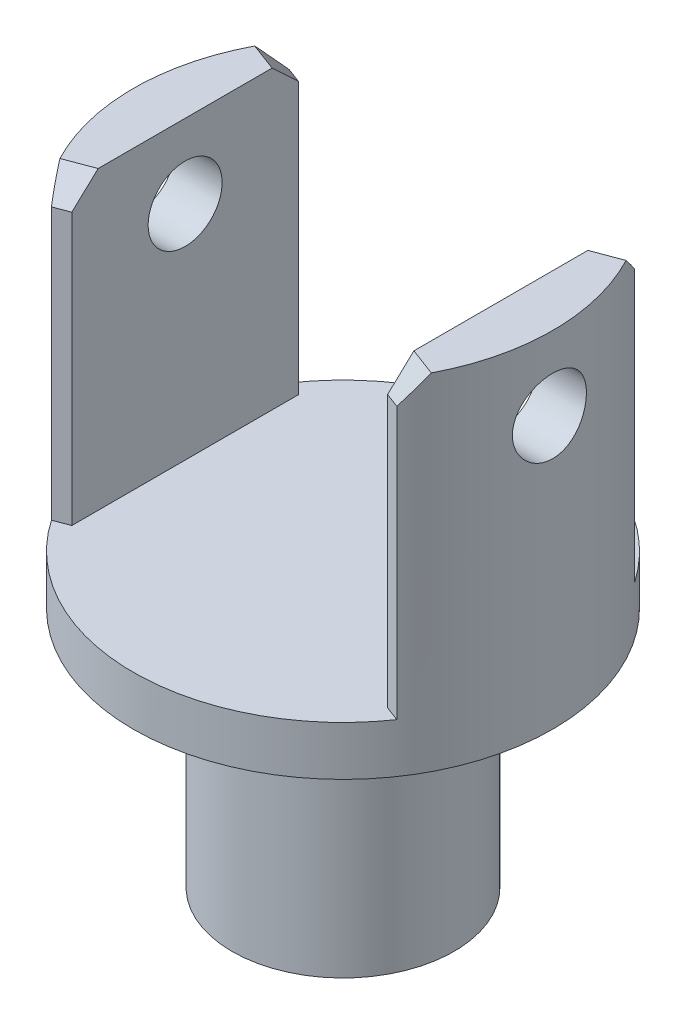
ISO-10303-21;
HEADER;
FILE_DESCRIPTION(('STEP AP214'),'2;1');
FILE_NAME('part.step','',(''),(''),'','','');
FILE_SCHEMA(('AUTOMOTIVE_DESIGN { 1 0 10303 214 1 1 1 1 }'));
ENDSEC;
DATA;
#1=APPLICATION_CONTEXT('core data for automotive mechanical design processes');
#2=APPLICATION_PROTOCOL_DEFINITION('international standard','automotive_design',2000,#1);
#3=PRODUCT_CONTEXT('',#1,'mechanical');
#4=PRODUCT('Part','Part','',(#3));
#5=PRODUCT_RELATED_PRODUCT_CATEGORY('part','',(#4));
#6=PRODUCT_DEFINITION_FORMATION('','',#4);
#7=PRODUCT_DEFINITION_CONTEXT('part definition',#1,'design');
#8=PRODUCT_DEFINITION('design','',#6,#7);
#9=PRODUCT_DEFINITION_SHAPE('','',#8);
#10=(LENGTH_UNIT() NAMED_UNIT(*) SI_UNIT(.MILLI.,.METRE.));
#11=(NAMED_UNIT(*) PLANE_ANGLE_UNIT() SI_UNIT($,.RADIAN.));
#12=(NAMED_UNIT(*) SI_UNIT($,.STERADIAN.) SOLID_ANGLE_UNIT());
#13=UNCERTAINTY_MEASURE_WITH_UNIT(LENGTH_MEASURE(1.E-05),#10,'distance_accuracy_value','');
#14=(GEOMETRIC_REPRESENTATION_CONTEXT(3) GLOBAL_UNCERTAINTY_ASSIGNED_CONTEXT((#13)) GLOBAL_UNIT_ASSIGNED_CONTEXT((#10,
#11,#12)) REPRESENTATION_CONTEXT('',''));
#15=CARTESIAN_POINT('',(0.,0.,0.));
#16=DIRECTION('',(0.,0.,1.));
#17=DIRECTION('',(1.,0.,0.));
#18=AXIS2_PLACEMENT_3D('',#15,#16,#17);
#19=CARTESIAN_POINT('',(0.,0.,0.));
#20=DIRECTION('',(0.,1.,0.));
#21=DIRECTION('',(0.,0.,1.));
#22=AXIS2_PLACEMENT_3D('',#19,#20,#21);
#23=PLANE('',#22);
#24=CARTESIAN_POINT('',(0.,0.,0.));
#25=DIRECTION('',(0.,1.,0.));
#26=DIRECTION('',(0.,0.,1.));
#27=AXIS2_PLACEMENT_3D('',#24,#25,#26);
#28=CIRCLE('',#27,42.5);
#29=CARTESIAN_POINT('',(0.,0.,42.5));
#30=VERTEX_POINT('',#29);
#31=EDGE_CURVE('E140',#30,#30,#28,.T.);
#32=ORIENTED_EDGE('',*,*,#31,.F.);
#33=EDGE_LOOP('',(#32));
#34=FACE_BOUND('',#33,.T.);
#35=CARTESIAN_POINT('',(0.,0.,0.));
#36=DIRECTION('',(0.,1.,0.));
#37=DIRECTION('',(0.,0.,1.));
#38=AXIS2_PLACEMENT_3D('',#35,#36,#37);
#39=CIRCLE('',#38,22.5);
#40=CARTESIAN_POINT('',(0.,0.,22.5));
#41=VERTEX_POINT('',#40);
#42=EDGE_CURVE('E156',#41,#41,#39,.F.);
#43=ORIENTED_EDGE('',*,*,#42,.F.);
#44=EDGE_LOOP('',(#43));
#45=FACE_BOUND('',#44,.T.);
#46=ADVANCED_FACE('F37',(#34,#45),#23,.F.);
#47=CARTESIAN_POINT('',(0.,10.,0.));
#48=DIRECTION('',(0.,-1.,0.));
#49=DIRECTION('',(0.,0.,-1.));
#50=AXIS2_PLACEMENT_3D('',#47,#48,#49);
#51=CYLINDRICAL_SURFACE('',#50,42.5);
#52=CARTESIAN_POINT('',(42.5,47.5,0.));
#53=CARTESIAN_POINT('',(42.5000015843816,47.4999965322837,0.208971756028196));
#54=CARTESIAN_POINT('',(42.4984559284556,47.50873642481,0.417897579424682));
#55=CARTESIAN_POINT('',(42.4923199044658,47.5436224004119,0.834309792806325));
#56=CARTESIAN_POINT('',(42.4877289580117,47.5697717900668,1.04179590178147));
#57=CARTESIAN_POINT('',(42.4756250727213,47.6393009875028,1.4538947696207));
#58=CARTESIAN_POINT('',(42.468110382591,47.6826911226538,1.65850573004607));
#59=CARTESIAN_POINT('',(42.4503666657007,47.7863851558372,2.06335614323716));
#60=CARTESIAN_POINT('',(42.4401366425856,47.8466952628903,2.26359396208816));
#61=CARTESIAN_POINT('',(42.4172627507622,47.9836811775456,2.65796760341749));
#62=CARTESIAN_POINT('',(42.4046218865797,48.0603366285505,2.8521106744371));
#63=CARTESIAN_POINT('',(42.3772627758924,48.2295223467274,3.23328438984087));
#64=CARTESIAN_POINT('',(42.3625437640462,48.322058465158,3.42031238152106));
#65=CARTESIAN_POINT('',(42.3314447983361,48.5222698071983,3.78581705140689));
#66=CARTESIAN_POINT('',(42.3150656488995,48.6299377083184,3.9642978100618));
#67=CARTESIAN_POINT('',(42.281083186,48.8597306536652,4.3116675302127));
#68=CARTESIAN_POINT('',(42.2634794178843,48.9818610792052,4.48055288658047));
#69=CARTESIAN_POINT('',(42.227369715604,49.2408901516393,4.80903349165545));
#70=CARTESIAN_POINT('',(42.2088569802131,49.3779141403321,4.96852916370818));
#71=CARTESIAN_POINT('',(42.1715902334673,49.6649022809873,5.27549973265357));
#72=CARTESIAN_POINT('',(42.1528361353016,49.8148712061829,5.42297015611845));
#73=CARTESIAN_POINT('',(42.1156236482904,50.1266341655236,5.70477381185432));
#74=CARTESIAN_POINT('',(42.0971651724591,50.2884246402778,5.83911097021541));
#75=CARTESIAN_POINT('',(42.0610505035486,50.6228314549881,6.09381550404746));
#76=CARTESIAN_POINT('',(42.043394608871,50.7954517656386,6.21417770903185));
#77=CARTESIAN_POINT('',(42.0092775591656,51.1514929182265,6.44079372900214));
#78=CARTESIAN_POINT('',(41.9928253242829,51.3349791010299,6.54694626628252));
#79=CARTESIAN_POINT('',(41.9617263533831,51.7104003206346,6.74339807129554));
#80=CARTESIAN_POINT('',(41.9470796303891,51.9023354183645,6.8336972246793));
#81=CARTESIAN_POINT('',(41.920022471165,52.2932856609952,6.99775914644412));
#82=CARTESIAN_POINT('',(41.9076118754919,52.4923002998895,7.07152309392944));
#83=CARTESIAN_POINT('',(41.8853935910238,52.8960009773547,7.20195703148256));
#84=CARTESIAN_POINT('',(41.8755859329703,53.1006870828758,7.25862681966456));
#85=CARTESIAN_POINT('',(41.8589551792492,53.5120750936945,7.35392343375065));
#86=CARTESIAN_POINT('',(41.8521019094752,53.7187334537379,7.39273296250719));
#87=CARTESIAN_POINT('',(41.8414321282765,54.1347252039663,7.45288458193651));
#88=CARTESIAN_POINT('',(41.8376166659262,54.3440594929196,7.47422063840472));
#89=CARTESIAN_POINT('',(41.8331430108166,54.7637382157095,7.49922168794211));
#90=CARTESIAN_POINT('',(41.8324834537189,54.9740821736774,7.50289431714135));
#91=CARTESIAN_POINT('',(41.834330383256,55.3943438443463,7.49258041115624));
#92=CARTESIAN_POINT('',(41.8368380338164,55.604261371936,7.47858738397252));
#93=CARTESIAN_POINT('',(41.8489397694095,56.2260507343383,7.4107239856831));
#94=CARTESIAN_POINT('',(41.8630584570048,56.6353540105169,7.33128011628425));
#95=CARTESIAN_POINT('',(41.9018728517382,57.4345006429692,7.10604245826615));
#96=CARTESIAN_POINT('',(41.9265689614605,57.824343257926,6.96024614421345));
#97=CARTESIAN_POINT('',(41.9839010530861,58.5762022113346,6.60563095735404));
#98=CARTESIAN_POINT('',(42.0165788262238,58.9380584384655,6.39647892850377));
#99=CARTESIAN_POINT('',(42.0861660120933,59.6218299533136,5.92132569462922));
#100=CARTESIAN_POINT('',(42.1230758065029,59.9437416330489,5.65531936015258));
#101=CARTESIAN_POINT('',(42.1975982191319,60.5432069071898,5.06960222407794));
#102=CARTESIAN_POINT('',(42.2352134675087,60.8200804526095,4.74919521811619));
#103=CARTESIAN_POINT('',(42.3064348742795,61.3162412426402,4.0661150832584));
#104=CARTESIAN_POINT('',(42.3400410006979,61.5355280279746,3.70344161730428));
#105=CARTESIAN_POINT('',(42.399514173817,61.9103714034904,2.94545217147781));
#106=CARTESIAN_POINT('',(42.4253733276422,62.06586305623,2.55010342047134));
#107=CARTESIAN_POINT('',(42.466376757523,62.3080449882121,1.73834239792173));
#108=CARTESIAN_POINT('',(42.4815220399896,62.39474172982,1.32193210873942));
#109=CARTESIAN_POINT('',(42.4992546358024,62.4959400618277,0.485725609346236));
#110=CARTESIAN_POINT('',(42.5020041968767,62.5113744707309,0.0660456118472763));
#111=CARTESIAN_POINT('',(42.4950815580175,62.4721026565934,-0.769901546289237));
#112=CARTESIAN_POINT('',(42.4854098961267,62.4173994716611,-1.18616885396623));
#113=CARTESIAN_POINT('',(42.4548326279661,62.2401856519729,-2.00055453868747));
#114=CARTESIAN_POINT('',(42.434004329616,62.1181414714492,-2.39877759580586));
#115=CARTESIAN_POINT('',(42.3834380061259,61.8101938321091,-3.16911928455364));
#116=CARTESIAN_POINT('',(42.3536994315653,61.6242864352899,-3.54123630469993));
#117=CARTESIAN_POINT('',(42.2882129406018,61.1918492057276,-4.25277972816308));
#118=CARTESIAN_POINT('',(42.2524089727167,60.9447429593935,-4.59184990723367));
#119=CARTESIAN_POINT('',(42.1788994165765,60.3974718245863,-5.22416576902034));
#120=CARTESIAN_POINT('',(42.141193672504,60.0973025834593,-5.5174076888131));
#121=CARTESIAN_POINT('',(42.0861439788137,59.6119294406167,-5.91819616764576));
#122=CARTESIAN_POINT('',(42.0679363368942,59.4431145976897,-6.04595482419614));
#123=CARTESIAN_POINT('',(42.0326190176694,59.0952348317839,-6.28678976386405));
#124=CARTESIAN_POINT('',(42.0155089378433,58.9161737126448,-6.39987144537649));
#125=CARTESIAN_POINT('',(41.9828740862213,58.5489686497882,-6.61057241827838));
#126=CARTESIAN_POINT('',(41.9673498616648,58.3608216035049,-6.70818637850123));
#127=CARTESIAN_POINT('',(41.938349706788,57.9768767231769,-6.88716503041474));
#128=CARTESIAN_POINT('',(41.9248730347205,57.7810816921622,-6.96853560980901));
#129=CARTESIAN_POINT('',(41.9004117792436,57.3840296237773,-7.11413551154874));
#130=CARTESIAN_POINT('',(41.889416690992,57.1827998077561,-7.17843730000206));
#131=CARTESIAN_POINT('',(41.8701693187093,56.77551403971,-7.28986431024438));
#132=CARTESIAN_POINT('',(41.8619169696446,56.5694582022399,-7.33698993930304));
#133=CARTESIAN_POINT('',(41.8484010617912,56.1540220941185,-7.41369326777319));
#134=CARTESIAN_POINT('',(41.8431373109697,55.9446420379544,-7.44327209466243));
#135=CARTESIAN_POINT('',(41.8357557749368,55.5240812402523,-7.48464979460728));
#136=CARTESIAN_POINT('',(41.8336379079105,55.3129005456871,-7.49644913005336));
#137=CARTESIAN_POINT('',(41.8326185977762,54.8932211896437,-7.5021348822358));
#138=CARTESIAN_POINT('',(41.8336729772965,54.6847259275124,-7.49626733087109));
#139=CARTESIAN_POINT('',(41.8388706953994,54.2690596302859,-7.46720269939585));
#140=CARTESIAN_POINT('',(41.8430129391977,54.0618881521001,-7.44401176118591));
#141=CARTESIAN_POINT('',(41.8542652150225,53.6502371950264,-7.38048248227054));
#142=CARTESIAN_POINT('',(41.8613757647722,53.4457581921729,-7.34014115022195));
#143=CARTESIAN_POINT('',(41.8783580691968,53.0409780002031,-7.24262187391176));
#144=CARTESIAN_POINT('',(41.8882297703261,52.8406767301513,-7.1854442561456));
#145=CARTESIAN_POINT('',(41.9104338355396,52.4459357197422,-7.05477968498075));
#146=CARTESIAN_POINT('',(41.922762571057,52.2514878168206,-6.98131676407772));
#147=CARTESIAN_POINT('',(41.9495391707747,51.8694816964518,-6.81857455926704));
#148=CARTESIAN_POINT('',(41.9639870258811,51.6819234494425,-6.72929534323342));
#149=CARTESIAN_POINT('',(41.9945989809355,51.3149226862459,-6.53553921869116));
#150=CARTESIAN_POINT('',(42.0107634636001,51.1354819926101,-6.43105891922101));
#151=CARTESIAN_POINT('',(42.0443499929109,50.7860219726656,-6.20768713493466));
#152=CARTESIAN_POINT('',(42.061771599545,50.6159993863579,-6.08880068268461));
#153=CARTESIAN_POINT('',(42.0976408462769,50.2841814742154,-5.83568251869345));
#154=CARTESIAN_POINT('',(42.1160992509179,50.1225302517005,-5.70126338052849));
#155=CARTESIAN_POINT('',(42.1532947504909,49.8111513865385,-5.41940362485638));
#156=CARTESIAN_POINT('',(42.1720317440057,49.6614195250802,-5.27196765392635));
#157=CARTESIAN_POINT('',(42.2092787482011,49.3747508342002,-4.96494787879748));
#158=CARTESIAN_POINT('',(42.2277886171943,49.2378216708024,-4.80535689886058));
#159=CARTESIAN_POINT('',(42.2640471313183,48.977853649779,-4.47525147859417));
#160=CARTESIAN_POINT('',(42.2817960547306,48.8548096869318,-4.30474108942497));
#161=CARTESIAN_POINT('',(42.316186690388,48.6224635520282,-3.95245682694832));
#162=CARTESIAN_POINT('',(42.3328180759603,48.5132829458027,-3.77060173098993));
#163=CARTESIAN_POINT('',(42.36433384878,48.3106954938111,-3.39825144399));
#164=CARTESIAN_POINT('',(42.379218878458,48.2172828419152,-3.20775946617255));
#165=CARTESIAN_POINT('',(42.4068158727596,48.0469358339419,-2.81953772650149));
#166=CARTESIAN_POINT('',(42.4195292917696,47.9699904404918,-2.62181291727639));
#167=CARTESIAN_POINT('',(42.4424298421545,47.8331046836633,-2.22048942140181));
#168=CARTESIAN_POINT('',(42.452617500402,47.7731607734069,-2.01689196969165));
#169=CARTESIAN_POINT('',(42.4740025225059,47.6483846740047,-1.51541171578506));
#170=CARTESIAN_POINT('',(42.483704673477,47.5928091404735,-1.21511099750755));
#171=CARTESIAN_POINT('',(42.4967021900869,47.5186197160895,-0.609840866809702));
#172=CARTESIAN_POINT('',(42.4999976885256,47.5000050590954,-0.30487155129415));
#173=CARTESIAN_POINT('',(42.5,47.5,0.));
#174=B_SPLINE_CURVE_WITH_KNOTS('',3,(#52,#53,#54,#55,#56,#57,#58,#59,#60,#61,#62,#63,#64,#65,
#66,#67,#68,#69,#70,#71,#72,#73,#74,#75,#76,#77,#78,#79,#80,#81,#82,#83,#84,#85,#86,#87,#88,#89,
#90,#91,#92,#93,#94,#95,#96,#97,#98,#99,#100,#101,#102,#103,#104,#105,#106,#107,#108,#109,#110,
#111,#112,#113,#114,#115,#116,#117,#118,#119,#120,#121,#122,#123,#124,#125,#126,#127,#128,#129,
#130,#131,#132,#133,#134,#135,#136,#137,#138,#139,#140,#141,#142,#143,#144,#145,#146,#147,#148,
#149,#150,#151,#152,#153,#154,#155,#156,#157,#158,#159,#160,#161,#162,#163,#164,#165,#166,#167,
#168,#169,#170,#171,#172,#173),.UNSPECIFIED.,.T.,.F.,(4,2,2,2,2,2,2,2,2,2,2,2,2,2,2,2,2,2,2,2,2,
2,2,2,2,2,2,2,2,2,2,2,2,2,2,2,2,2,2,2,2,2,2,2,2,2,2,2,2,2,2,2,2,2,2,2,2,2,2,2,4),(0.,
0.626647912315759,1.25341487760058,1.88055784959741,2.50793126219531,3.13452785635298,
3.7613558187029,4.38788148768688,5.01464101541468,5.64715728557616,6.27990779028707,
6.91246855688484,7.54526261904132,8.18235064145595,8.81944325893394,9.45649043169511,
10.0935451278297,10.7239296636148,11.3545318016658,11.9848612976654,12.6154225025828,
13.8605410695771,15.1057070308625,16.3575378392634,17.6094816368034,18.8788573937788,
20.1482432742098,21.4189180833068,22.6894735153,23.9433494180435,25.197171009223,
26.4424147789643,27.6877353480634,28.945263736371,30.2028953251843,30.8397431237093,
31.4763560129317,32.1131878446656,32.7497884245055,33.383641428425,34.0174794018661,
34.6512766433473,35.2850574014065,35.9100530394006,36.5348271941327,37.1597103656695,
37.7845814200403,38.4085364086669,39.0324887197189,39.6565804321207,40.2804547528913,
40.9128508806541,41.54502216974,42.177569599332,42.8098836949259,43.4474072200286,
44.0846954795194,44.7215552419511,45.3582820437368,46.272525599928,47.1867502050807),.UNSPECIFIED.);
#175=CARTESIAN_POINT('',(42.5,47.5,0.));
#176=VERTEX_POINT('',#175);
#177=EDGE_CURVE('E171',#176,#176,#174,.T.);
#178=ORIENTED_EDGE('',*,*,#177,.T.);
#179=EDGE_LOOP('',(#178));
#180=FACE_BOUND('',#179,.T.);
#181=DIRECTION('',(0.,-1.,0.));
#182=VECTOR('',#181,1.);
#183=CARTESIAN_POINT('',(35.0077348900633,10.,-24.0978940546067));
#184=LINE('',#183,#182);
#185=CARTESIAN_POINT('',(35.0077348900633,10.,-24.0978940546067));
#186=VERTEX_POINT('',#185);
#187=CARTESIAN_POINT('',(35.0077348900633,65.,-24.0978940546067));
#188=VERTEX_POINT('',#187);
#189=EDGE_CURVE('E158',#186,#188,#184,.F.);
#190=ORIENTED_EDGE('',*,*,#189,.T.);
#191=CARTESIAN_POINT('',(0.,75.2563688504466,0.));
#192=DIRECTION('',(-0.248525060873855,0.707106781186546,-0.661993424527501));
#193=DIRECTION('',(-0.248525060873854,-0.707106781186549,-0.661993424527499));
#194=AXIS2_PLACEMENT_3D('',#191,#192,#193);
#195=ELLIPSE('',#194,60.1040764008567,42.5);
#196=CARTESIAN_POINT('',(37.6355741232439,70.,-19.7436967261405));
#197=VERTEX_POINT('',#196);
#198=EDGE_CURVE('E213',#188,#197,#195,.F.);
#199=ORIENTED_EDGE('',*,*,#198,.T.);
#200=CARTESIAN_POINT('',(0.,70.,0.));
#201=DIRECTION('',(0.,1.,0.));
#202=DIRECTION('',(0.,0.,1.));
#203=AXIS2_PLACEMENT_3D('',#200,#201,#202);
#204=CIRCLE('',#203,42.5);
#205=CARTESIAN_POINT('',(37.6355741232439,70.,19.7436967261406));
#206=VERTEX_POINT('',#205);
#207=EDGE_CURVE('E170',#206,#197,#204,.T.);
#208=ORIENTED_EDGE('',*,*,#207,.F.);
#209=CARTESIAN_POINT('',(0.,75.2563688504466,0.));
#210=DIRECTION('',(-0.248525060873855,0.707106781186546,0.661993424527501));
#211=DIRECTION('',(-0.248525060873855,-0.707106781186549,0.661993424527499));
#212=AXIS2_PLACEMENT_3D('',#209,#210,#211);
#213=ELLIPSE('',#212,60.1040764008567,42.5);
#214=CARTESIAN_POINT('',(35.0077348900632,65.,24.0978940546068));
#215=VERTEX_POINT('',#214);
#216=EDGE_CURVE('E211',#206,#215,#213,.F.);
#217=ORIENTED_EDGE('',*,*,#216,.T.);
#218=DIRECTION('',(0.,-1.,0.));
#219=VECTOR('',#218,1.);
#220=CARTESIAN_POINT('',(35.0077348900632,10.,24.0978940546068));
#221=LINE('',#220,#219);
#222=CARTESIAN_POINT('',(35.0077348900632,10.,24.0978940546068));
#223=VERTEX_POINT('',#222);
#224=EDGE_CURVE('E136',#215,#223,#221,.T.);
#225=ORIENTED_EDGE('',*,*,#224,.T.);
#226=CARTESIAN_POINT('',(0.,10.,0.));
#227=DIRECTION('',(0.,1.,0.));
#228=DIRECTION('',(0.,0.,1.));
#229=AXIS2_PLACEMENT_3D('',#226,#227,#228);
#230=CIRCLE('',#229,42.5);
#231=CARTESIAN_POINT('',(-35.0077348900632,10.,24.0978940546068));
#232=VERTEX_POINT('',#231);
#233=EDGE_CURVE('E127',#232,#223,#230,.T.);
#234=ORIENTED_EDGE('',*,*,#233,.F.);
#235=DIRECTION('',(0.,-1.,0.));
#236=VECTOR('',#235,1.);
#237=CARTESIAN_POINT('',(-35.0077348900632,10.,24.0978940546068));
#238=LINE('',#237,#236);
#239=CARTESIAN_POINT('',(-35.0077348900632,64.9999999999999,24.0978940546068));
#240=VERTEX_POINT('',#239);
#241=EDGE_CURVE('E133',#232,#240,#238,.F.);
#242=ORIENTED_EDGE('',*,*,#241,.T.);
#243=CARTESIAN_POINT('',(0.,75.2563688504466,0.));
#244=DIRECTION('',(0.248525060873857,0.707106781186545,0.661993424527502));
#245=DIRECTION('',(0.248525060873855,-0.70710678118655,0.661993424527497));
#246=AXIS2_PLACEMENT_3D('',#243,#244,#245);
#247=ELLIPSE('',#246,60.1040764008568,42.5);
#248=CARTESIAN_POINT('',(-37.6355741232439,70.,19.7436967261406));
#249=VERTEX_POINT('',#248);
#250=EDGE_CURVE('E207',#240,#249,#247,.F.);
#251=ORIENTED_EDGE('',*,*,#250,.T.);
#252=CARTESIAN_POINT('',(0.,70.,0.));
#253=DIRECTION('',(0.,-1.,0.));
#254=DIRECTION('',(0.,0.,1.));
#255=AXIS2_PLACEMENT_3D('',#252,#253,#254);
#256=CIRCLE('',#255,42.5);
#257=CARTESIAN_POINT('',(-37.6355741232439,70.,-19.7436967261406));
#258=VERTEX_POINT('',#257);
#259=EDGE_CURVE('E237',#249,#258,#256,.T.);
#260=ORIENTED_EDGE('',*,*,#259,.T.);
#261=CARTESIAN_POINT('',(0.,75.2563688504466,0.));
#262=DIRECTION('',(0.248525060873855,0.707106781186546,-0.661993424527501));
#263=DIRECTION('',(0.248525060873855,-0.707106781186549,-0.661993424527499));
#264=AXIS2_PLACEMENT_3D('',#261,#262,#263);
#265=ELLIPSE('',#264,60.1040764008567,42.5);
#266=CARTESIAN_POINT('',(-35.0077348900632,65.,-24.0978940546068));
#267=VERTEX_POINT('',#266);
#268=EDGE_CURVE('E209',#258,#267,#265,.F.);
#269=ORIENTED_EDGE('',*,*,#268,.T.);
#270=DIRECTION('',(0.,-1.,0.));
#271=VECTOR('',#270,1.);
#272=CARTESIAN_POINT('',(-35.0077348900632,10.,-24.0978940546068));
#273=LINE('',#272,#271);
#274=CARTESIAN_POINT('',(-35.0077348900632,10.,-24.0978940546068));
#275=VERTEX_POINT('',#274);
#276=EDGE_CURVE('E155',#267,#275,#273,.T.);
#277=ORIENTED_EDGE('',*,*,#276,.T.);
#278=EDGE_CURVE('E139',#186,#275,#230,.T.);
#279=ORIENTED_EDGE('',*,*,#278,.F.);
#280=EDGE_LOOP('',(#190,#199,#208,#217,#225,#234,#242,#251,#260,#269,#277,#279));
#281=FACE_BOUND('',#280,.T.);
#282=ORIENTED_EDGE('',*,*,#31,.T.);
#283=EDGE_LOOP('',(#282));
#284=FACE_BOUND('',#283,.T.);
#285=CARTESIAN_POINT('',(-42.5,47.5,0.));
#286=CARTESIAN_POINT('',(-42.5000015843816,47.4999965322837,0.208971756028196));
#287=CARTESIAN_POINT('',(-42.4984559284556,47.50873642481,0.417897579424682));
#288=CARTESIAN_POINT('',(-42.4923199044658,47.5436224004119,0.834309792806325));
#289=CARTESIAN_POINT('',(-42.4877289580117,47.5697717900668,1.04179590178147));
#290=CARTESIAN_POINT('',(-42.4756250727213,47.6393009875028,1.4538947696207));
#291=CARTESIAN_POINT('',(-42.468110382591,47.6826911226538,1.65850573004607));
#292=CARTESIAN_POINT('',(-42.4503666657007,47.7863851558372,2.06335614323716));
#293=CARTESIAN_POINT('',(-42.4401366425856,47.8466952628903,2.26359396208816));
#294=CARTESIAN_POINT('',(-42.4172627507622,47.9836811775456,2.65796760341749));
#295=CARTESIAN_POINT('',(-42.4046218865797,48.0603366285505,2.8521106744371));
#296=CARTESIAN_POINT('',(-42.3772627758924,48.2295223467274,3.23328438984087));
#297=CARTESIAN_POINT('',(-42.3625437640462,48.322058465158,3.42031238152106));
#298=CARTESIAN_POINT('',(-42.3314447983361,48.5222698071983,3.78581705140689));
#299=CARTESIAN_POINT('',(-42.3150656488995,48.6299377083184,3.9642978100618));
#300=CARTESIAN_POINT('',(-42.281083186,48.8597306536652,4.3116675302127));
#301=CARTESIAN_POINT('',(-42.2634794178843,48.9818610792052,4.48055288658047));
#302=CARTESIAN_POINT('',(-42.227369715604,49.2408901516393,4.80903349165545));
#303=CARTESIAN_POINT('',(-42.2088569802131,49.3779141403321,4.96852916370818));
#304=CARTESIAN_POINT('',(-42.1715902334673,49.6649022809873,5.27549973265357));
#305=CARTESIAN_POINT('',(-42.1528361353016,49.8148712061829,5.42297015611845));
#306=CARTESIAN_POINT('',(-42.1156236482904,50.1266341655236,5.70477381185432));
#307=CARTESIAN_POINT('',(-42.0971651724591,50.2884246402778,5.83911097021541));
#308=CARTESIAN_POINT('',(-42.0610505035486,50.6228314549881,6.09381550404746));
#309=CARTESIAN_POINT('',(-42.043394608871,50.7954517656386,6.21417770903185));
#310=CARTESIAN_POINT('',(-42.0092775591656,51.1514929182265,6.44079372900214));
#311=CARTESIAN_POINT('',(-41.9928253242829,51.3349791010299,6.54694626628252));
#312=CARTESIAN_POINT('',(-41.9617263533831,51.7104003206346,6.74339807129554));
#313=CARTESIAN_POINT('',(-41.9470796303891,51.9023354183645,6.8336972246793));
#314=CARTESIAN_POINT('',(-41.920022471165,52.2932856609952,6.99775914644412));
#315=CARTESIAN_POINT('',(-41.9076118754919,52.4923002998895,7.07152309392944));
#316=CARTESIAN_POINT('',(-41.8853935910238,52.8960009773547,7.20195703148256));
#317=CARTESIAN_POINT('',(-41.8755859329703,53.1006870828758,7.25862681966456));
#318=CARTESIAN_POINT('',(-41.8589551792492,53.5120750936945,7.35392343375065));
#319=CARTESIAN_POINT('',(-41.8521019094752,53.7187334537379,7.39273296250719));
#320=CARTESIAN_POINT('',(-41.8414321282765,54.1347252039663,7.45288458193651));
#321=CARTESIAN_POINT('',(-41.8376166659262,54.3440594929196,7.47422063840472));
#322=CARTESIAN_POINT('',(-41.8331430108166,54.7637382157095,7.49922168794211));
#323=CARTESIAN_POINT('',(-41.8324834537189,54.9740821736774,7.50289431714135));
#324=CARTESIAN_POINT('',(-41.834330383256,55.3943438443463,7.49258041115624));
#325=CARTESIAN_POINT('',(-41.8368380338164,55.604261371936,7.47858738397252));
#326=CARTESIAN_POINT('',(-41.8489397694095,56.2260507343383,7.4107239856831));
#327=CARTESIAN_POINT('',(-41.8630584570048,56.6353540105169,7.33128011628425));
#328=CARTESIAN_POINT('',(-41.9018728517382,57.4345006429692,7.10604245826615));
#329=CARTESIAN_POINT('',(-41.9265689614605,57.824343257926,6.96024614421345));
#330=CARTESIAN_POINT('',(-41.9839010530861,58.5762022113346,6.60563095735404));
#331=CARTESIAN_POINT('',(-42.0165788262238,58.9380584384655,6.39647892850377));
#332=CARTESIAN_POINT('',(-42.0861660120933,59.6218299533136,5.92132569462922));
#333=CARTESIAN_POINT('',(-42.1230758065029,59.9437416330489,5.65531936015258));
#334=CARTESIAN_POINT('',(-42.1975982191319,60.5432069071898,5.06960222407794));
#335=CARTESIAN_POINT('',(-42.2352134675087,60.8200804526095,4.74919521811619));
#336=CARTESIAN_POINT('',(-42.3064348742795,61.3162412426402,4.0661150832584));
#337=CARTESIAN_POINT('',(-42.3400410006979,61.5355280279746,3.70344161730428));
#338=CARTESIAN_POINT('',(-42.399514173817,61.9103714034904,2.94545217147781));
#339=CARTESIAN_POINT('',(-42.4253733276422,62.06586305623,2.55010342047134));
#340=CARTESIAN_POINT('',(-42.466376757523,62.3080449882121,1.73834239792173));
#341=CARTESIAN_POINT('',(-42.4815220399896,62.39474172982,1.32193210873942));
#342=CARTESIAN_POINT('',(-42.4992546358024,62.4959400618277,0.485725609346236));
#343=CARTESIAN_POINT('',(-42.5020041968767,62.5113744707309,0.0660456118472763));
#344=CARTESIAN_POINT('',(-42.4950815580175,62.4721026565934,-0.769901546289237));
#345=CARTESIAN_POINT('',(-42.4854098961267,62.4173994716611,-1.18616885396623));
#346=CARTESIAN_POINT('',(-42.4548326279661,62.2401856519729,-2.00055453868747));
#347=CARTESIAN_POINT('',(-42.434004329616,62.1181414714492,-2.39877759580586));
#348=CARTESIAN_POINT('',(-42.3834380061259,61.8101938321091,-3.16911928455364));
#349=CARTESIAN_POINT('',(-42.3536994315653,61.6242864352899,-3.54123630469993));
#350=CARTESIAN_POINT('',(-42.2882129406018,61.1918492057276,-4.25277972816308));
#351=CARTESIAN_POINT('',(-42.2524089727167,60.9447429593935,-4.59184990723367));
#352=CARTESIAN_POINT('',(-42.1788994165765,60.3974718245863,-5.22416576902034));
#353=CARTESIAN_POINT('',(-42.141193672504,60.0973025834593,-5.5174076888131));
#354=CARTESIAN_POINT('',(-42.0861439788137,59.6119294406167,-5.91819616764576));
#355=CARTESIAN_POINT('',(-42.0679363368942,59.4431145976897,-6.04595482419614));
#356=CARTESIAN_POINT('',(-42.0326190176694,59.0952348317839,-6.28678976386405));
#357=CARTESIAN_POINT('',(-42.0155089378433,58.9161737126448,-6.39987144537649));
#358=CARTESIAN_POINT('',(-41.9828740862213,58.5489686497882,-6.61057241827838));
#359=CARTESIAN_POINT('',(-41.9673498616648,58.3608216035049,-6.70818637850123));
#360=CARTESIAN_POINT('',(-41.938349706788,57.9768767231769,-6.88716503041474));
#361=CARTESIAN_POINT('',(-41.9248730347205,57.7810816921622,-6.96853560980901));
#362=CARTESIAN_POINT('',(-41.9004117792436,57.3840296237773,-7.11413551154874));
#363=CARTESIAN_POINT('',(-41.889416690992,57.1827998077561,-7.17843730000206));
#364=CARTESIAN_POINT('',(-41.8701693187093,56.77551403971,-7.28986431024438));
#365=CARTESIAN_POINT('',(-41.8619169696446,56.5694582022399,-7.33698993930304));
#366=CARTESIAN_POINT('',(-41.8484010617912,56.1540220941185,-7.41369326777319));
#367=CARTESIAN_POINT('',(-41.8431373109697,55.9446420379544,-7.44327209466243));
#368=CARTESIAN_POINT('',(-41.8357557749368,55.5240812402523,-7.48464979460728));
#369=CARTESIAN_POINT('',(-41.8336379079105,55.3129005456871,-7.49644913005336));
#370=CARTESIAN_POINT('',(-41.8326185977762,54.8932211896437,-7.5021348822358));
#371=CARTESIAN_POINT('',(-41.8336729772965,54.6847259275124,-7.49626733087109));
#372=CARTESIAN_POINT('',(-41.8388706953994,54.2690596302859,-7.46720269939585));
#373=CARTESIAN_POINT('',(-41.8430129391977,54.0618881521001,-7.44401176118591));
#374=CARTESIAN_POINT('',(-41.8542652150225,53.6502371950264,-7.38048248227054));
#375=CARTESIAN_POINT('',(-41.8613757647722,53.4457581921729,-7.34014115022195));
#376=CARTESIAN_POINT('',(-41.8783580691968,53.0409780002031,-7.24262187391176));
#377=CARTESIAN_POINT('',(-41.8882297703261,52.8406767301513,-7.1854442561456));
#378=CARTESIAN_POINT('',(-41.9104338355396,52.4459357197422,-7.05477968498075));
#379=CARTESIAN_POINT('',(-41.922762571057,52.2514878168206,-6.98131676407772));
#380=CARTESIAN_POINT('',(-41.9495391707747,51.8694816964518,-6.81857455926704));
#381=CARTESIAN_POINT('',(-41.9639870258811,51.6819234494425,-6.72929534323342));
#382=CARTESIAN_POINT('',(-41.9945989809355,51.3149226862459,-6.53553921869116));
#383=CARTESIAN_POINT('',(-42.0107634636001,51.1354819926101,-6.43105891922101));
#384=CARTESIAN_POINT('',(-42.0443499929109,50.7860219726656,-6.20768713493466));
#385=CARTESIAN_POINT('',(-42.061771599545,50.6159993863579,-6.08880068268461));
#386=CARTESIAN_POINT('',(-42.0976408462769,50.2841814742154,-5.83568251869345));
#387=CARTESIAN_POINT('',(-42.1160992509179,50.1225302517005,-5.70126338052849));
#388=CARTESIAN_POINT('',(-42.1532947504909,49.8111513865385,-5.41940362485638));
#389=CARTESIAN_POINT('',(-42.1720317440057,49.6614195250802,-5.27196765392635));
#390=CARTESIAN_POINT('',(-42.2092787482011,49.3747508342002,-4.96494787879748));
#391=CARTESIAN_POINT('',(-42.2277886171943,49.2378216708024,-4.80535689886058));
#392=CARTESIAN_POINT('',(-42.2640471313183,48.977853649779,-4.47525147859417));
#393=CARTESIAN_POINT('',(-42.2817960547306,48.8548096869318,-4.30474108942497));
#394=CARTESIAN_POINT('',(-42.316186690388,48.6224635520282,-3.95245682694832));
#395=CARTESIAN_POINT('',(-42.3328180759603,48.5132829458027,-3.77060173098993));
#396=CARTESIAN_POINT('',(-42.36433384878,48.3106954938111,-3.39825144399));
#397=CARTESIAN_POINT('',(-42.379218878458,48.2172828419152,-3.20775946617255));
#398=CARTESIAN_POINT('',(-42.4068158727596,48.0469358339419,-2.81953772650149));
#399=CARTESIAN_POINT('',(-42.4195292917696,47.9699904404918,-2.62181291727639));
#400=CARTESIAN_POINT('',(-42.4424298421545,47.8331046836633,-2.22048942140181));
#401=CARTESIAN_POINT('',(-42.452617500402,47.7731607734069,-2.01689196969165));
#402=CARTESIAN_POINT('',(-42.4740025225059,47.6483846740047,-1.51541171578506));
#403=CARTESIAN_POINT('',(-42.483704673477,47.5928091404735,-1.21511099750755));
#404=CARTESIAN_POINT('',(-42.4967021900869,47.5186197160895,-0.609840866809702));
#405=CARTESIAN_POINT('',(-42.4999976885256,47.5000050590954,-0.30487155129415));
#406=CARTESIAN_POINT('',(-42.5,47.5,0.));
#407=B_SPLINE_CURVE_WITH_KNOTS('',3,(#285,#286,#287,#288,#289,#290,#291,#292,#293,#294,#295,
#296,#297,#298,#299,#300,#301,#302,#303,#304,#305,#306,#307,#308,#309,#310,#311,#312,#313,#314,
#315,#316,#317,#318,#319,#320,#321,#322,#323,#324,#325,#326,#327,#328,#329,#330,#331,#332,#333,
#334,#335,#336,#337,#338,#339,#340,#341,#342,#343,#344,#345,#346,#347,#348,#349,#350,#351,#352,
#353,#354,#355,#356,#357,#358,#359,#360,#361,#362,#363,#364,#365,#366,#367,#368,#369,#370,#371,
#372,#373,#374,#375,#376,#377,#378,#379,#380,#381,#382,#383,#384,#385,#386,#387,#388,#389,#390,
#391,#392,#393,#394,#395,#396,#397,#398,#399,#400,#401,#402,#403,#404,#405,#406),.UNSPECIFIED.,
.T.,.F.,(4,2,2,2,2,2,2,2,2,2,2,2,2,2,2,2,2,2,2,2,2,2,2,2,2,2,2,2,2,2,2,2,2,2,2,2,2,2,2,2,2,2,2,
2,2,2,2,2,2,2,2,2,2,2,2,2,2,2,2,2,4),(0.,0.626647912315759,1.25341487760058,1.88055784959741,
2.50793126219531,3.13452785635298,3.7613558187029,4.38788148768688,5.01464101541468,
5.64715728557616,6.27990779028707,6.91246855688484,7.54526261904132,8.18235064145595,
8.81944325893394,9.45649043169511,10.0935451278297,10.7239296636148,11.3545318016658,
11.9848612976654,12.6154225025828,13.8605410695771,15.1057070308625,16.3575378392634,
17.6094816368034,18.8788573937788,20.1482432742098,21.4189180833068,22.6894735153,
23.9433494180435,25.197171009223,26.4424147789643,27.6877353480634,28.945263736371,
30.2028953251843,30.8397431237093,31.4763560129317,32.1131878446656,32.7497884245055,
33.383641428425,34.0174794018661,34.6512766433473,35.2850574014065,35.9100530394006,
36.5348271941327,37.1597103656695,37.7845814200403,38.4085364086669,39.0324887197189,
39.6565804321207,40.2804547528913,40.9128508806541,41.54502216974,42.177569599332,
42.8098836949259,43.4474072200286,44.0846954795194,44.7215552419511,45.3582820437368,
46.272525599928,47.1867502050807),.UNSPECIFIED.);
#408=CARTESIAN_POINT('',(-42.5,47.5,0.));
#409=VERTEX_POINT('',#408);
#410=EDGE_CURVE('E241',#409,#409,#407,.T.);
#411=ORIENTED_EDGE('',*,*,#410,.F.);
#412=EDGE_LOOP('',(#411));
#413=FACE_BOUND('',#412,.T.);
#414=ADVANCED_FACE('F130',(#180,#281,#284,#413),#51,.T.);
#415=CARTESIAN_POINT('',(-32.,70.,-27.968732541894));
#416=DIRECTION('',(1.,0.,0.));
#417=DIRECTION('',(0.,0.,-1.));
#418=AXIS2_PLACEMENT_3D('',#415,#416,#417);
#419=PLANE('',#418);
#420=DIRECTION('',(0.,1.,0.));
#421=VECTOR('',#420,1.);
#422=CARTESIAN_POINT('',(-32.,70.,-22.968732541894));
#423=LINE('',#422,#421);
#424=CARTESIAN_POINT('',(-32.,10.,-22.968732541894));
#425=VERTEX_POINT('',#424);
#426=CARTESIAN_POINT('',(-32.,65.,-22.968732541894));
#427=VERTEX_POINT('',#426);
#428=EDGE_CURVE('E190',#425,#427,#423,.T.);
#429=ORIENTED_EDGE('',*,*,#428,.T.);
#430=DIRECTION('',(0.,0.683435907381544,0.73001052081567));
#431=VECTOR('',#430,1.);
#432=CARTESIAN_POINT('',(-32.,64.8408461840335,-23.1387323309432));
#433=LINE('',#432,#431);
#434=CARTESIAN_POINT('',(-32.,70.,-17.6279938352275));
#435=VERTEX_POINT('',#434);
#436=EDGE_CURVE('E45',#427,#435,#433,.T.);
#437=ORIENTED_EDGE('',*,*,#436,.T.);
#438=DIRECTION('',(0.,0.,1.));
#439=VECTOR('',#438,1.);
#440=CARTESIAN_POINT('',(-32.,70.,-27.968732541894));
#441=LINE('',#440,#439);
#442=CARTESIAN_POINT('',(-32.,70.,17.6279938352275));
#443=VERTEX_POINT('',#442);
#444=EDGE_CURVE('E228',#435,#443,#441,.T.);
#445=ORIENTED_EDGE('',*,*,#444,.T.);
#446=DIRECTION('',(0.,-0.683435907381545,0.730010520815669));
#447=VECTOR('',#446,1.);
#448=CARTESIAN_POINT('',(-32.,92.7489091018663,-6.67120203972739));
#449=LINE('',#448,#447);
#450=CARTESIAN_POINT('',(-32.,65.,22.968732541894));
#451=VERTEX_POINT('',#450);
#452=EDGE_CURVE('E52',#443,#451,#449,.T.);
#453=ORIENTED_EDGE('',*,*,#452,.T.);
#454=DIRECTION('',(0.,-1.,0.));
#455=VECTOR('',#454,1.);
#456=CARTESIAN_POINT('',(-32.,10.,22.968732541894));
#457=LINE('',#456,#455);
#458=CARTESIAN_POINT('',(-32.,10.,22.968732541894));
#459=VERTEX_POINT('',#458);
#460=EDGE_CURVE('E381',#451,#459,#457,.T.);
#461=ORIENTED_EDGE('',*,*,#460,.T.);
#462=DIRECTION('',(0.,0.,1.));
#463=VECTOR('',#462,1.);
#464=CARTESIAN_POINT('',(-32.,10.,-27.968732541894));
#465=LINE('',#464,#463);
#466=EDGE_CURVE('E148',#425,#459,#465,.T.);
#467=ORIENTED_EDGE('',*,*,#466,.F.);
#468=EDGE_LOOP('',(#429,#437,#445,#453,#461,#467));
#469=FACE_BOUND('',#468,.T.);
#470=CARTESIAN_POINT('',(-32.,55.,0.));
#471=DIRECTION('',(-1.,0.,0.));
#472=DIRECTION('',(0.,0.,1.));
#473=AXIS2_PLACEMENT_3D('',#470,#471,#472);
#474=CIRCLE('',#473,7.5);
#475=CARTESIAN_POINT('',(-32.,55.,7.5));
#476=VERTEX_POINT('',#475);
#477=EDGE_CURVE('E424',#476,#476,#474,.T.);
#478=ORIENTED_EDGE('',*,*,#477,.T.);
#479=EDGE_LOOP('',(#478));
#480=FACE_BOUND('',#479,.T.);
#481=ADVANCED_FACE('F226',(#469,#480),#419,.T.);
#482=CARTESIAN_POINT('',(0.,10.,0.));
#483=DIRECTION('',(0.,1.,0.));
#484=DIRECTION('',(0.,0.,1.));
#485=AXIS2_PLACEMENT_3D('',#482,#483,#484);
#486=PLANE('',#485);
#487=ORIENTED_EDGE('',*,*,#278,.T.);
#488=DIRECTION('',(-0.9362000791686,0.,-0.351467511677405));
#489=VECTOR('',#488,1.);
#490=CARTESIAN_POINT('',(-35.0077348900632,10.,-24.0978940546068));
#491=LINE('',#490,#489);
#492=EDGE_CURVE('E151',#275,#425,#491,.F.);
#493=ORIENTED_EDGE('',*,*,#492,.T.);
#494=ORIENTED_EDGE('',*,*,#466,.T.);
#495=DIRECTION('',(0.9362000791686,0.,-0.351467511677406));
#496=VECTOR('',#495,1.);
#497=CARTESIAN_POINT('',(-32.,10.,22.968732541894));
#498=LINE('',#497,#496);
#499=EDGE_CURVE('E144',#459,#232,#498,.F.);
#500=ORIENTED_EDGE('',*,*,#499,.T.);
#501=ORIENTED_EDGE('',*,*,#233,.T.);
#502=DIRECTION('',(0.9362000791686,0.,0.351467511677405));
#503=VECTOR('',#502,1.);
#504=CARTESIAN_POINT('',(35.0077348900632,10.,24.0978940546068));
#505=LINE('',#504,#503);
#506=CARTESIAN_POINT('',(32.,10.,22.968732541894));
#507=VERTEX_POINT('',#506);
#508=EDGE_CURVE('E192',#223,#507,#505,.F.);
#509=ORIENTED_EDGE('',*,*,#508,.T.);
#510=DIRECTION('',(0.,0.,1.));
#511=VECTOR('',#510,1.);
#512=CARTESIAN_POINT('',(32.,10.,-27.968732541894));
#513=LINE('',#512,#511);
#514=CARTESIAN_POINT('',(32.,10.,-22.9687325418939));
#515=VERTEX_POINT('',#514);
#516=EDGE_CURVE('E166',#515,#507,#513,.T.);
#517=ORIENTED_EDGE('',*,*,#516,.F.);
#518=DIRECTION('',(-0.936200079168601,0.,0.351467511677404));
#519=VECTOR('',#518,1.);
#520=CARTESIAN_POINT('',(32.,10.,-22.9687325418939));
#521=LINE('',#520,#519);
#522=EDGE_CURVE('E187',#515,#186,#521,.F.);
#523=ORIENTED_EDGE('',*,*,#522,.T.);
#524=EDGE_LOOP('',(#487,#493,#494,#500,#501,#509,#517,#523));
#525=FACE_BOUND('',#524,.T.);
#526=ADVANCED_FACE('F146',(#525),#486,.T.);
#527=CARTESIAN_POINT('',(32.,70.,-27.968732541894));
#528=DIRECTION('',(1.,0.,0.));
#529=DIRECTION('',(0.,0.,-1.));
#530=AXIS2_PLACEMENT_3D('',#527,#528,#529);
#531=PLANE('',#530);
#532=CARTESIAN_POINT('',(32.,55.,0.));
#533=DIRECTION('',(-1.,0.,0.));
#534=DIRECTION('',(0.,0.,1.));
#535=AXIS2_PLACEMENT_3D('',#532,#533,#534);
#536=CIRCLE('',#535,7.5);
#537=CARTESIAN_POINT('',(32.,55.,7.5));
#538=VERTEX_POINT('',#537);
#539=EDGE_CURVE('E236',#538,#538,#536,.T.);
#540=ORIENTED_EDGE('',*,*,#539,.F.);
#541=EDGE_LOOP('',(#540));
#542=FACE_BOUND('',#541,.T.);
#543=DIRECTION('',(0.,0.,1.));
#544=VECTOR('',#543,1.);
#545=CARTESIAN_POINT('',(32.,70.,-27.968732541894));
#546=LINE('',#545,#544);
#547=CARTESIAN_POINT('',(32.,70.,-17.6279938352274));
#548=VERTEX_POINT('',#547);
#549=CARTESIAN_POINT('',(32.,70.,17.6279938352275));
#550=VERTEX_POINT('',#549);
#551=EDGE_CURVE('E176',#548,#550,#546,.T.);
#552=ORIENTED_EDGE('',*,*,#551,.F.);
#553=DIRECTION('',(0.,-0.683435907381544,-0.73001052081567));
#554=VECTOR('',#553,1.);
#555=CARTESIAN_POINT('',(32.,76.3397084933682,-10.8562485273246));
#556=LINE('',#555,#554);
#557=CARTESIAN_POINT('',(32.,65.,-22.9687325418939));
#558=VERTEX_POINT('',#557);
#559=EDGE_CURVE('E203',#548,#558,#556,.T.);
#560=ORIENTED_EDGE('',*,*,#559,.T.);
#561=DIRECTION('',(0.,-1.,0.));
#562=VECTOR('',#561,1.);
#563=CARTESIAN_POINT('',(32.,70.,-22.9687325418939));
#564=LINE('',#563,#562);
#565=EDGE_CURVE('E165',#558,#515,#564,.T.);
#566=ORIENTED_EDGE('',*,*,#565,.T.);
#567=ORIENTED_EDGE('',*,*,#516,.T.);
#568=DIRECTION('',(0.,1.,0.));
#569=VECTOR('',#568,1.);
#570=CARTESIAN_POINT('',(32.,70.,22.968732541894));
#571=LINE('',#570,#569);
#572=CARTESIAN_POINT('',(32.,65.,22.968732541894));
#573=VERTEX_POINT('',#572);
#574=EDGE_CURVE('E374',#507,#573,#571,.T.);
#575=ORIENTED_EDGE('',*,*,#574,.T.);
#576=DIRECTION('',(0.,0.683435907381544,-0.73001052081567));
#577=VECTOR('',#576,1.);
#578=CARTESIAN_POINT('',(32.,76.3397084933682,10.8562485273247));
#579=LINE('',#578,#577);
#580=EDGE_CURVE('E201',#573,#550,#579,.T.);
#581=ORIENTED_EDGE('',*,*,#580,.T.);
#582=EDGE_LOOP('',(#552,#560,#566,#567,#575,#581));
#583=FACE_BOUND('',#582,.T.);
#584=ADVANCED_FACE('F271',(#542,#583),#531,.F.);
#585=CARTESIAN_POINT('',(0.,70.,0.));
#586=DIRECTION('',(0.,1.,0.));
#587=DIRECTION('',(0.,0.,1.));
#588=AXIS2_PLACEMENT_3D('',#585,#586,#587);
#589=PLANE('',#588);
#590=ORIENTED_EDGE('',*,*,#207,.T.);
#591=DIRECTION('',(-0.9362000791686,0.,0.351467511677404));
#592=VECTOR('',#591,1.);
#593=CARTESIAN_POINT('',(-1.84744288032508,70.,-4.92101293392745));
#594=LINE('',#593,#592);
#595=EDGE_CURVE('E198',#197,#548,#594,.T.);
#596=ORIENTED_EDGE('',*,*,#595,.T.);
#597=ORIENTED_EDGE('',*,*,#551,.T.);
#598=DIRECTION('',(0.9362000791686,0.,0.351467511677405));
#599=VECTOR('',#598,1.);
#600=CARTESIAN_POINT('',(-1.84744288032509,70.,4.92101293392747));
#601=LINE('',#600,#599);
#602=EDGE_CURVE('E150',#550,#206,#601,.T.);
#603=ORIENTED_EDGE('',*,*,#602,.T.);
#604=EDGE_LOOP('',(#590,#596,#597,#603));
#605=FACE_BOUND('',#604,.T.);
#606=ADVANCED_FACE('F266',(#605),#589,.T.);
#607=CARTESIAN_POINT('',(42.5,55.,0.));
#608=DIRECTION('',(-1.,0.,0.));
#609=DIRECTION('',(0.,0.,1.));
#610=AXIS2_PLACEMENT_3D('',#607,#608,#609);
#611=CYLINDRICAL_SURFACE('',#610,7.5);
#612=ORIENTED_EDGE('',*,*,#539,.T.);
#613=EDGE_LOOP('',(#612));
#614=FACE_BOUND('',#613,.T.);
#615=ORIENTED_EDGE('',*,*,#177,.F.);
#616=EDGE_LOOP('',(#615));
#617=FACE_BOUND('',#616,.T.);
#618=ADVANCED_FACE('F261',(#614,#617),#611,.F.);
#619=CARTESIAN_POINT('',(0.,70.,0.));
#620=DIRECTION('',(0.,1.,0.));
#621=DIRECTION('',(0.,0.,1.));
#622=AXIS2_PLACEMENT_3D('',#619,#620,#621);
#623=PLANE('',#622);
#624=ORIENTED_EDGE('',*,*,#444,.F.);
#625=DIRECTION('',(-0.9362000791686,0.,-0.351467511677405));
#626=VECTOR('',#625,1.);
#627=CARTESIAN_POINT('',(1.84744288032509,70.,-4.92101293392747));
#628=LINE('',#627,#626);
#629=EDGE_CURVE('E220',#435,#258,#628,.T.);
#630=ORIENTED_EDGE('',*,*,#629,.T.);
#631=ORIENTED_EDGE('',*,*,#259,.F.);
#632=DIRECTION('',(0.9362000791686,0.,-0.351467511677406));
#633=VECTOR('',#632,1.);
#634=CARTESIAN_POINT('',(1.84744288032509,70.,4.92101293392747));
#635=LINE('',#634,#633);
#636=EDGE_CURVE('E217',#249,#443,#635,.T.);
#637=ORIENTED_EDGE('',*,*,#636,.T.);
#638=EDGE_LOOP('',(#624,#630,#631,#637));
#639=FACE_BOUND('',#638,.T.);
#640=ADVANCED_FACE('F232',(#639),#623,.T.);
#641=CARTESIAN_POINT('',(-42.5,55.,0.));
#642=DIRECTION('',(1.,0.,0.));
#643=DIRECTION('',(0.,0.,-1.));
#644=AXIS2_PLACEMENT_3D('',#641,#642,#643);
#645=CYLINDRICAL_SURFACE('',#644,7.5);
#646=ORIENTED_EDGE('',*,*,#477,.F.);
#647=EDGE_LOOP('',(#646));
#648=FACE_BOUND('',#647,.T.);
#649=ORIENTED_EDGE('',*,*,#410,.T.);
#650=EDGE_LOOP('',(#649));
#651=FACE_BOUND('',#650,.T.);
#652=ADVANCED_FACE('F291',(#648,#651),#645,.F.);
#653=CARTESIAN_POINT('',(0.,-49.,0.));
#654=DIRECTION('',(0.,1.,0.));
#655=DIRECTION('',(0.,0.,1.));
#656=AXIS2_PLACEMENT_3D('',#653,#654,#655);
#657=CYLINDRICAL_SURFACE('',#656,22.5);
#658=CARTESIAN_POINT('',(0.,-49.,0.));
#659=DIRECTION('',(0.,-1.,0.));
#660=DIRECTION('',(0.,0.,-1.));
#661=AXIS2_PLACEMENT_3D('',#658,#659,#660);
#662=CIRCLE('',#661,22.5);
#663=CARTESIAN_POINT('',(0.,-49.,-22.5));
#664=VERTEX_POINT('',#663);
#665=EDGE_CURVE('E423',#664,#664,#662,.T.);
#666=ORIENTED_EDGE('',*,*,#665,.F.);
#667=EDGE_LOOP('',(#666));
#668=FACE_BOUND('',#667,.T.);
#669=ORIENTED_EDGE('',*,*,#42,.T.);
#670=EDGE_LOOP('',(#669));
#671=FACE_BOUND('',#670,.T.);
#672=ADVANCED_FACE('F289',(#668,#671),#657,.T.);
#673=CARTESIAN_POINT('',(0.,-49.,0.));
#674=DIRECTION('',(0.,-1.,0.));
#675=DIRECTION('',(0.,0.,-1.));
#676=AXIS2_PLACEMENT_3D('',#673,#674,#675);
#677=PLANE('',#676);
#678=ORIENTED_EDGE('',*,*,#665,.T.);
#679=EDGE_LOOP('',(#678));
#680=FACE_BOUND('',#679,.T.);
#681=ADVANCED_FACE('F290',(#680),#677,.T.);
#682=CARTESIAN_POINT('',(35.0077348900632,10.,24.0978940546068));
#683=DIRECTION('',(0.351467511677405,0.,-0.9362000791686));
#684=DIRECTION('',(0.,-1.,0.));
#685=AXIS2_PLACEMENT_3D('',#682,#683,#684);
#686=PLANE('',#685);
#687=ORIENTED_EDGE('',*,*,#224,.F.);
#688=DIRECTION('',(0.9362000791686,0.,0.351467511677405));
#689=VECTOR('',#688,1.);
#690=CARTESIAN_POINT('',(35.0077348900632,65.,24.0978940546068));
#691=LINE('',#690,#689);
#692=EDGE_CURVE('E215',#215,#573,#691,.F.);
#693=ORIENTED_EDGE('',*,*,#692,.T.);
#694=ORIENTED_EDGE('',*,*,#574,.F.);
#695=ORIENTED_EDGE('',*,*,#508,.F.);
#696=EDGE_LOOP('',(#687,#693,#694,#695));
#697=FACE_BOUND('',#696,.T.);
#698=ADVANCED_FACE('F297',(#697),#686,.F.);
#699=CARTESIAN_POINT('',(32.,10.,-22.9687325418939));
#700=DIRECTION('',(0.351467511677404,0.,0.9362000791686));
#701=DIRECTION('',(0.,-1.,0.));
#702=AXIS2_PLACEMENT_3D('',#699,#700,#701);
#703=PLANE('',#702);
#704=ORIENTED_EDGE('',*,*,#565,.F.);
#705=DIRECTION('',(-0.936200079168601,0.,0.351467511677404));
#706=VECTOR('',#705,1.);
#707=CARTESIAN_POINT('',(32.,65.,-22.9687325418939));
#708=LINE('',#707,#706);
#709=EDGE_CURVE('E205',#558,#188,#708,.F.);
#710=ORIENTED_EDGE('',*,*,#709,.T.);
#711=ORIENTED_EDGE('',*,*,#189,.F.);
#712=ORIENTED_EDGE('',*,*,#522,.F.);
#713=EDGE_LOOP('',(#704,#710,#711,#712));
#714=FACE_BOUND('',#713,.T.);
#715=ADVANCED_FACE('F316',(#714),#703,.F.);
#716=CARTESIAN_POINT('',(-35.0077348900632,10.,-24.0978940546068));
#717=DIRECTION('',(-0.351467511677405,0.,0.9362000791686));
#718=DIRECTION('',(0.,-1.,0.));
#719=AXIS2_PLACEMENT_3D('',#716,#717,#718);
#720=PLANE('',#719);
#721=ORIENTED_EDGE('',*,*,#276,.F.);
#722=DIRECTION('',(-0.9362000791686,0.,-0.351467511677405));
#723=VECTOR('',#722,1.);
#724=CARTESIAN_POINT('',(-35.0077348900632,65.,-24.0978940546068));
#725=LINE('',#724,#723);
#726=EDGE_CURVE('E60',#267,#427,#725,.F.);
#727=ORIENTED_EDGE('',*,*,#726,.T.);
#728=ORIENTED_EDGE('',*,*,#428,.F.);
#729=ORIENTED_EDGE('',*,*,#492,.F.);
#730=EDGE_LOOP('',(#721,#727,#728,#729));
#731=FACE_BOUND('',#730,.T.);
#732=ADVANCED_FACE('F189',(#731),#720,.F.);
#733=CARTESIAN_POINT('',(-32.,10.,22.968732541894));
#734=DIRECTION('',(-0.351467511677406,0.,-0.9362000791686));
#735=DIRECTION('',(0.,-1.,0.));
#736=AXIS2_PLACEMENT_3D('',#733,#734,#735);
#737=PLANE('',#736);
#738=ORIENTED_EDGE('',*,*,#460,.F.);
#739=DIRECTION('',(0.9362000791686,0.,-0.351467511677406));
#740=VECTOR('',#739,1.);
#741=CARTESIAN_POINT('',(-32.,65.,22.968732541894));
#742=LINE('',#741,#740);
#743=EDGE_CURVE('E11',#451,#240,#742,.F.);
#744=ORIENTED_EDGE('',*,*,#743,.T.);
#745=ORIENTED_EDGE('',*,*,#241,.F.);
#746=ORIENTED_EDGE('',*,*,#499,.F.);
#747=EDGE_LOOP('',(#738,#744,#745,#746));
#748=FACE_BOUND('',#747,.T.);
#749=ADVANCED_FACE('F153',(#748),#737,.F.);
#750=CARTESIAN_POINT('',(-1.84744288032508,70.,-4.92101293392745));
#751=DIRECTION('',(-0.248525060873855,0.707106781186546,-0.661993424527501));
#752=DIRECTION('',(0.936200079168601,0.,-0.351467511677404));
#753=AXIS2_PLACEMENT_3D('',#750,#751,#752);
#754=PLANE('',#753);
#755=ORIENTED_EDGE('',*,*,#198,.F.);
#756=ORIENTED_EDGE('',*,*,#709,.F.);
#757=ORIENTED_EDGE('',*,*,#559,.F.);
#758=ORIENTED_EDGE('',*,*,#595,.F.);
#759=EDGE_LOOP('',(#755,#756,#757,#758));
#760=FACE_BOUND('',#759,.T.);
#761=ADVANCED_FACE('F337',(#760),#754,.T.);
#762=CARTESIAN_POINT('',(-1.84744288032509,70.,4.92101293392747));
#763=DIRECTION('',(-0.248525060873855,0.707106781186546,0.661993424527501));
#764=DIRECTION('',(-0.9362000791686,0.,-0.351467511677405));
#765=AXIS2_PLACEMENT_3D('',#762,#763,#764);
#766=PLANE('',#765);
#767=ORIENTED_EDGE('',*,*,#580,.F.);
#768=ORIENTED_EDGE('',*,*,#692,.F.);
#769=ORIENTED_EDGE('',*,*,#216,.F.);
#770=ORIENTED_EDGE('',*,*,#602,.F.);
#771=EDGE_LOOP('',(#767,#768,#769,#770));
#772=FACE_BOUND('',#771,.T.);
#773=ADVANCED_FACE('F344',(#772),#766,.T.);
#774=CARTESIAN_POINT('',(1.84744288032509,70.,-4.92101293392747));
#775=DIRECTION('',(0.248525060873855,0.707106781186546,-0.661993424527501));
#776=DIRECTION('',(0.9362000791686,0.,0.351467511677405));
#777=AXIS2_PLACEMENT_3D('',#774,#775,#776);
#778=PLANE('',#777);
#779=ORIENTED_EDGE('',*,*,#436,.F.);
#780=ORIENTED_EDGE('',*,*,#726,.F.);
#781=ORIENTED_EDGE('',*,*,#268,.F.);
#782=ORIENTED_EDGE('',*,*,#629,.F.);
#783=EDGE_LOOP('',(#779,#780,#781,#782));
#784=FACE_BOUND('',#783,.T.);
#785=ADVANCED_FACE('F239',(#784),#778,.T.);
#786=CARTESIAN_POINT('',(1.84744288032509,70.,4.92101293392746));
#787=DIRECTION('',(0.248525060873857,0.707106781186545,0.661993424527502));
#788=DIRECTION('',(-0.9362000791686,0.,0.351467511677406));
#789=AXIS2_PLACEMENT_3D('',#786,#787,#788);
#790=PLANE('',#789);
#791=ORIENTED_EDGE('',*,*,#250,.F.);
#792=ORIENTED_EDGE('',*,*,#743,.F.);
#793=ORIENTED_EDGE('',*,*,#452,.F.);
#794=ORIENTED_EDGE('',*,*,#636,.F.);
#795=EDGE_LOOP('',(#791,#792,#793,#794));
#796=FACE_BOUND('',#795,.T.);
#797=ADVANCED_FACE('F39',(#796),#790,.T.);
#798=CLOSED_SHELL('',(#46,#414,#481,#526,#584,#606,#618,#640,#652,#672,#681,#698,#715,#732,#749,
#761,#773,#785,#797));
#799=MANIFOLD_SOLID_BREP('B2',#798);
#800=ADVANCED_BREP_SHAPE_REPRESENTATION('',(#18,#799),#14);
#801=SHAPE_DEFINITION_REPRESENTATION(#9,#800);
ENDSEC;
END-ISO-10303-21;
